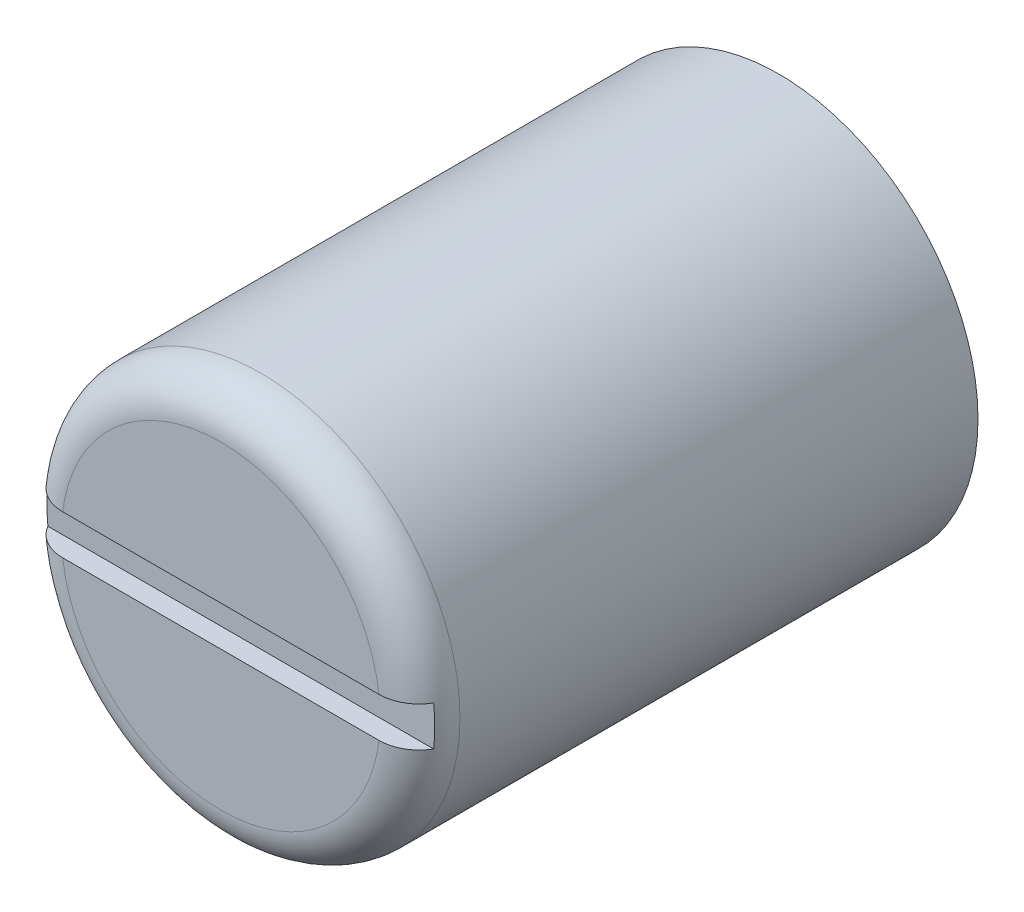
ISO-10303-21;
HEADER;
FILE_DESCRIPTION(('STEP AP214'),'2;1');
FILE_NAME('part.step','',(''),(''),'','','');
FILE_SCHEMA(('AUTOMOTIVE_DESIGN { 1 0 10303 214 1 1 1 1 }'));
ENDSEC;
DATA;
#1=APPLICATION_CONTEXT('core data for automotive mechanical design processes');
#2=APPLICATION_PROTOCOL_DEFINITION('international standard','automotive_design',2000,#1);
#3=PRODUCT_CONTEXT('',#1,'mechanical');
#4=PRODUCT('Part','Part','',(#3));
#5=PRODUCT_RELATED_PRODUCT_CATEGORY('part','',(#4));
#6=PRODUCT_DEFINITION_FORMATION('','',#4);
#7=PRODUCT_DEFINITION_CONTEXT('part definition',#1,'design');
#8=PRODUCT_DEFINITION('design','',#6,#7);
#9=PRODUCT_DEFINITION_SHAPE('','',#8);
#10=(LENGTH_UNIT() NAMED_UNIT(*) SI_UNIT(.MILLI.,.METRE.));
#11=(NAMED_UNIT(*) PLANE_ANGLE_UNIT() SI_UNIT($,.RADIAN.));
#12=(NAMED_UNIT(*) SI_UNIT($,.STERADIAN.) SOLID_ANGLE_UNIT());
#13=UNCERTAINTY_MEASURE_WITH_UNIT(LENGTH_MEASURE(1.E-05),#10,'distance_accuracy_value','');
#14=(GEOMETRIC_REPRESENTATION_CONTEXT(3) GLOBAL_UNCERTAINTY_ASSIGNED_CONTEXT((#13)) GLOBAL_UNIT_ASSIGNED_CONTEXT((#10,
#11,#12)) REPRESENTATION_CONTEXT('',''));
#15=CARTESIAN_POINT('',(0.,0.,0.));
#16=DIRECTION('',(0.,0.,1.));
#17=DIRECTION('',(1.,0.,0.));
#18=AXIS2_PLACEMENT_3D('',#15,#16,#17);
#19=CARTESIAN_POINT('',(15.4419708147866,-61.9743537667184,15.));
#20=DIRECTION('',(0.,0.,1.));
#21=DIRECTION('',(1.,0.,0.));
#22=AXIS2_PLACEMENT_3D('',#19,#20,#21);
#23=PLANE('',#22);
#24=DIRECTION('',(1.,0.,0.));
#25=VECTOR('',#24,1.);
#26=CARTESIAN_POINT('',(10.4419708147866,-62.4743537667184,15.));
#27=LINE('',#26,#25);
#28=CARTESIAN_POINT('',(11.4733438481897,-62.4743537667184,15.));
#29=VERTEX_POINT('',#28);
#30=CARTESIAN_POINT('',(19.4105977813835,-62.4743537667184,15.));
#31=VERTEX_POINT('',#30);
#32=EDGE_CURVE('E128',#29,#31,#27,.T.);
#33=ORIENTED_EDGE('',*,*,#32,.F.);
#34=CARTESIAN_POINT('',(15.4419708147866,-61.9743537667184,15.));
#35=DIRECTION('',(0.,0.,1.));
#36=DIRECTION('',(1.,0.,0.));
#37=AXIS2_PLACEMENT_3D('',#34,#35,#36);
#38=CIRCLE('',#37,4.);
#39=EDGE_CURVE('E135',#29,#31,#38,.T.);
#40=ORIENTED_EDGE('',*,*,#39,.T.);
#41=EDGE_LOOP('',(#33,#40));
#42=FACE_BOUND('',#41,.T.);
#43=ADVANCED_FACE('F48',(#42),#23,.T.);
#44=CARTESIAN_POINT('',(15.4419708147866,-61.9743537667184,15.));
#45=DIRECTION('',(0.,0.,-1.));
#46=DIRECTION('',(-1.,0.,0.));
#47=AXIS2_PLACEMENT_3D('',#44,#45,#46);
#48=CYLINDRICAL_SURFACE('',#47,5.);
#49=CARTESIAN_POINT('',(15.4419708147866,-61.9743537667184,14.));
#50=DIRECTION('',(0.,0.,1.));
#51=DIRECTION('',(1.,0.,0.));
#52=AXIS2_PLACEMENT_3D('',#49,#50,#51);
#53=CIRCLE('',#52,5.);
#54=CARTESIAN_POINT('',(20.4419708147866,-61.9743537667184,14.));
#55=VERTEX_POINT('',#54);
#56=EDGE_CURVE('E134',#55,#55,#53,.F.);
#57=ORIENTED_EDGE('',*,*,#56,.T.);
#58=EDGE_LOOP('',(#57));
#59=FACE_BOUND('',#58,.T.);
#60=CARTESIAN_POINT('',(15.4419708147866,-61.9743537667184,1.));
#61=DIRECTION('',(0.,0.,1.));
#62=DIRECTION('',(1.,0.,0.));
#63=AXIS2_PLACEMENT_3D('',#60,#61,#62);
#64=CIRCLE('',#63,5.);
#65=CARTESIAN_POINT('',(20.4419708147866,-61.9743537667184,1.));
#66=VERTEX_POINT('',#65);
#67=EDGE_CURVE('E201',#66,#66,#64,.T.);
#68=ORIENTED_EDGE('',*,*,#67,.T.);
#69=EDGE_LOOP('',(#68));
#70=FACE_BOUND('',#69,.T.);
#71=ADVANCED_FACE('F188',(#59,#70),#48,.T.);
#72=DIRECTION('',(-1.,0.,0.));
#73=VECTOR('',#72,1.);
#74=CARTESIAN_POINT('',(10.4419708147866,-61.4743537667184,15.));
#75=LINE('',#74,#73);
#76=CARTESIAN_POINT('',(19.4105977813835,-61.4743537667184,15.));
#77=VERTEX_POINT('',#76);
#78=CARTESIAN_POINT('',(11.4733438481897,-61.4743537667184,15.));
#79=VERTEX_POINT('',#78);
#80=EDGE_CURVE('E118',#77,#79,#75,.T.);
#81=ORIENTED_EDGE('',*,*,#80,.F.);
#82=EDGE_CURVE('E127',#77,#79,#38,.T.);
#83=ORIENTED_EDGE('',*,*,#82,.T.);
#84=EDGE_LOOP('',(#81,#83));
#85=FACE_BOUND('',#84,.T.);
#86=ADVANCED_FACE('F126',(#85),#23,.T.);
#87=CARTESIAN_POINT('',(15.4419708147866,-61.9743537667184,1.));
#88=DIRECTION('',(0.,0.,1.));
#89=DIRECTION('',(1.,0.,0.));
#90=AXIS2_PLACEMENT_3D('',#87,#88,#89);
#91=PLANE('',#90);
#92=DIRECTION('',(1.,0.,0.));
#93=VECTOR('',#92,1.);
#94=CARTESIAN_POINT('',(15.4419708147866,-65.0743537667184,1.));
#95=LINE('',#94,#93);
#96=CARTESIAN_POINT('',(14.3669708147866,-65.0743537667184,1.));
#97=VERTEX_POINT('',#96);
#98=CARTESIAN_POINT('',(16.5169708147866,-65.0743537667184,1.));
#99=VERTEX_POINT('',#98);
#100=EDGE_CURVE('E216',#97,#99,#95,.T.);
#101=ORIENTED_EDGE('',*,*,#100,.T.);
#102=DIRECTION('',(0.,1.,0.));
#103=VECTOR('',#102,1.);
#104=CARTESIAN_POINT('',(16.5169708147866,-61.9743537667184,1.));
#105=LINE('',#104,#103);
#106=CARTESIAN_POINT('',(16.5169708147866,-58.8743537667184,1.));
#107=VERTEX_POINT('',#106);
#108=EDGE_CURVE('E141',#99,#107,#105,.T.);
#109=ORIENTED_EDGE('',*,*,#108,.T.);
#110=DIRECTION('',(-1.,0.,0.));
#111=VECTOR('',#110,1.);
#112=CARTESIAN_POINT('',(15.4419708147866,-58.8743537667184,1.));
#113=LINE('',#112,#111);
#114=CARTESIAN_POINT('',(14.3669708147866,-58.8743537667184,1.));
#115=VERTEX_POINT('',#114);
#116=EDGE_CURVE('E203',#107,#115,#113,.T.);
#117=ORIENTED_EDGE('',*,*,#116,.T.);
#118=DIRECTION('',(0.,-1.,0.));
#119=VECTOR('',#118,1.);
#120=CARTESIAN_POINT('',(14.3669708147866,-61.9743537667184,1.));
#121=LINE('',#120,#119);
#122=EDGE_CURVE('E207',#115,#97,#121,.T.);
#123=ORIENTED_EDGE('',*,*,#122,.T.);
#124=EDGE_LOOP('',(#101,#109,#117,#123));
#125=FACE_BOUND('',#124,.T.);
#126=ORIENTED_EDGE('',*,*,#67,.F.);
#127=EDGE_LOOP('',(#126));
#128=FACE_BOUND('',#127,.T.);
#129=ADVANCED_FACE('F184',(#125,#128),#91,.F.);
#130=CARTESIAN_POINT('',(16.5169708147866,-65.0743537667184,-1.5));
#131=DIRECTION('',(1.,0.,0.));
#132=DIRECTION('',(0.,0.,-1.));
#133=AXIS2_PLACEMENT_3D('',#130,#131,#132);
#134=PLANE('',#133);
#135=DIRECTION('',(0.,0.,1.));
#136=VECTOR('',#135,1.);
#137=CARTESIAN_POINT('',(16.5169708147866,-65.0743537667184,-1.5));
#138=LINE('',#137,#136);
#139=CARTESIAN_POINT('',(16.5169708147866,-65.0743537667184,13.5));
#140=VERTEX_POINT('',#139);
#141=EDGE_CURVE('E204',#99,#140,#138,.T.);
#142=ORIENTED_EDGE('',*,*,#141,.T.);
#143=DIRECTION('',(0.,1.,0.));
#144=VECTOR('',#143,1.);
#145=CARTESIAN_POINT('',(16.5169708147866,-65.0743537667184,13.5));
#146=LINE('',#145,#144);
#147=CARTESIAN_POINT('',(16.5169708147866,-58.8743537667184,13.5));
#148=VERTEX_POINT('',#147);
#149=EDGE_CURVE('E236',#140,#148,#146,.T.);
#150=ORIENTED_EDGE('',*,*,#149,.T.);
#151=DIRECTION('',(0.,0.,1.));
#152=VECTOR('',#151,1.);
#153=CARTESIAN_POINT('',(16.5169708147866,-58.8743537667184,-1.5));
#154=LINE('',#153,#152);
#155=EDGE_CURVE('E212',#107,#148,#154,.T.);
#156=ORIENTED_EDGE('',*,*,#155,.F.);
#157=ORIENTED_EDGE('',*,*,#108,.F.);
#158=EDGE_LOOP('',(#142,#150,#156,#157));
#159=FACE_BOUND('',#158,.T.);
#160=ADVANCED_FACE('F175',(#159),#134,.F.);
#161=CARTESIAN_POINT('',(14.3669708147866,-65.0743537667184,-1.5));
#162=DIRECTION('',(0.,-1.,0.));
#163=DIRECTION('',(0.,0.,-1.));
#164=AXIS2_PLACEMENT_3D('',#161,#162,#163);
#165=PLANE('',#164);
#166=DIRECTION('',(0.,0.,1.));
#167=VECTOR('',#166,1.);
#168=CARTESIAN_POINT('',(14.3669708147866,-65.0743537667184,-1.5));
#169=LINE('',#168,#167);
#170=CARTESIAN_POINT('',(14.3669708147866,-65.0743537667184,13.5));
#171=VERTEX_POINT('',#170);
#172=EDGE_CURVE('E209',#97,#171,#169,.T.);
#173=ORIENTED_EDGE('',*,*,#172,.T.);
#174=DIRECTION('',(1.,0.,0.));
#175=VECTOR('',#174,1.);
#176=CARTESIAN_POINT('',(14.3669708147866,-65.0743537667184,13.5));
#177=LINE('',#176,#175);
#178=EDGE_CURVE('E226',#171,#140,#177,.T.);
#179=ORIENTED_EDGE('',*,*,#178,.T.);
#180=ORIENTED_EDGE('',*,*,#141,.F.);
#181=ORIENTED_EDGE('',*,*,#100,.F.);
#182=EDGE_LOOP('',(#173,#179,#180,#181));
#183=FACE_BOUND('',#182,.T.);
#184=ADVANCED_FACE('F171',(#183),#165,.F.);
#185=CARTESIAN_POINT('',(14.3669708147866,-65.0743537667184,-1.5));
#186=DIRECTION('',(-1.,0.,0.));
#187=DIRECTION('',(0.,0.,1.));
#188=AXIS2_PLACEMENT_3D('',#185,#186,#187);
#189=PLANE('',#188);
#190=DIRECTION('',(0.,0.,1.));
#191=VECTOR('',#190,1.);
#192=CARTESIAN_POINT('',(14.3669708147866,-58.8743537667184,-1.5));
#193=LINE('',#192,#191);
#194=CARTESIAN_POINT('',(14.3669708147866,-58.8743537667184,13.5));
#195=VERTEX_POINT('',#194);
#196=EDGE_CURVE('E76',#115,#195,#193,.T.);
#197=ORIENTED_EDGE('',*,*,#196,.T.);
#198=DIRECTION('',(0.,-1.,0.));
#199=VECTOR('',#198,1.);
#200=CARTESIAN_POINT('',(14.3669708147866,-65.0743537667184,13.5));
#201=LINE('',#200,#199);
#202=EDGE_CURVE('E229',#195,#171,#201,.T.);
#203=ORIENTED_EDGE('',*,*,#202,.T.);
#204=ORIENTED_EDGE('',*,*,#172,.F.);
#205=ORIENTED_EDGE('',*,*,#122,.F.);
#206=EDGE_LOOP('',(#197,#203,#204,#205));
#207=FACE_BOUND('',#206,.T.);
#208=ADVANCED_FACE('F174',(#207),#189,.F.);
#209=CARTESIAN_POINT('',(14.3669708147866,-58.8743537667184,-1.5));
#210=DIRECTION('',(0.,1.,0.));
#211=DIRECTION('',(0.,0.,1.));
#212=AXIS2_PLACEMENT_3D('',#209,#210,#211);
#213=PLANE('',#212);
#214=ORIENTED_EDGE('',*,*,#155,.T.);
#215=DIRECTION('',(-1.,0.,0.));
#216=VECTOR('',#215,1.);
#217=CARTESIAN_POINT('',(14.3669708147866,-58.8743537667184,13.5));
#218=LINE('',#217,#216);
#219=EDGE_CURVE('E231',#148,#195,#218,.T.);
#220=ORIENTED_EDGE('',*,*,#219,.T.);
#221=ORIENTED_EDGE('',*,*,#196,.F.);
#222=ORIENTED_EDGE('',*,*,#116,.F.);
#223=EDGE_LOOP('',(#214,#220,#221,#222));
#224=FACE_BOUND('',#223,.T.);
#225=ADVANCED_FACE('F169',(#224),#213,.F.);
#226=CARTESIAN_POINT('',(0.,0.,13.5));
#227=DIRECTION('',(0.,0.,-1.));
#228=DIRECTION('',(-1.,0.,0.));
#229=AXIS2_PLACEMENT_3D('',#226,#227,#228);
#230=PLANE('',#229);
#231=ORIENTED_EDGE('',*,*,#149,.F.);
#232=ORIENTED_EDGE('',*,*,#178,.F.);
#233=ORIENTED_EDGE('',*,*,#202,.F.);
#234=ORIENTED_EDGE('',*,*,#219,.F.);
#235=EDGE_LOOP('',(#231,#232,#233,#234));
#236=FACE_BOUND('',#235,.T.);
#237=ADVANCED_FACE('F162',(#236),#230,.T.);
#238=CARTESIAN_POINT('',(15.4419708147866,-61.9743537667184,14.));
#239=DIRECTION('',(0.,0.,1.));
#240=DIRECTION('',(1.,0.,0.));
#241=AXIS2_PLACEMENT_3D('',#238,#239,#240);
#242=TOROIDAL_SURFACE('',#241,4.,1.);
#243=CARTESIAN_POINT('',(18.5634032544821,-62.4743537667184,14.5444774529158));
#244=CARTESIAN_POINT('',(18.5945514288023,-62.4743537667184,14.5918529383722));
#245=CARTESIAN_POINT('',(18.6297596805643,-62.4743537667184,14.6366120911453));
#246=CARTESIAN_POINT('',(18.7072372831449,-62.4743537667184,14.7196070409792));
#247=CARTESIAN_POINT('',(18.7495161613722,-62.4743537667184,14.7578338935686));
#248=CARTESIAN_POINT('',(18.8398406210106,-62.4743537667184,14.8266391287087));
#249=CARTESIAN_POINT('',(18.8878809931753,-62.4743537667184,14.8572243444173));
#250=CARTESIAN_POINT('',(18.9883737984209,-62.4743537667184,14.9099456164324));
#251=CARTESIAN_POINT('',(19.0408250592627,-62.4743537667184,14.9320839089901));
#252=CARTESIAN_POINT('',(19.149026371219,-62.4743537667184,14.9674322522597));
#253=CARTESIAN_POINT('',(19.2047953173074,-62.4743537667184,14.9805844967894));
#254=CARTESIAN_POINT('',(19.3177520387492,-62.4743537667184,14.9973579815571));
#255=CARTESIAN_POINT('',(19.374939900161,-62.4743537667184,15.0009786422631));
#256=CARTESIAN_POINT('',(19.4892055798111,-62.4743537667184,14.9985673019673));
#257=CARTESIAN_POINT('',(19.5462830722008,-62.4743537667184,14.9925197362638));
#258=CARTESIAN_POINT('',(19.6586027137608,-62.4743537667184,14.9708899488506));
#259=CARTESIAN_POINT('',(19.7138448945469,-62.4743537667184,14.9553078914751));
#260=CARTESIAN_POINT('',(19.8206926505908,-62.4743537667184,14.9151058941002));
#261=CARTESIAN_POINT('',(19.8723114954291,-62.4743537667184,14.8905212305091));
#262=CARTESIAN_POINT('',(19.9706530317092,-62.4743537667184,14.8329826115909));
#263=CARTESIAN_POINT('',(20.0173758851745,-62.4743537667184,14.800028933344));
#264=CARTESIAN_POINT('',(20.1042899798965,-62.4743537667184,14.7269061248427));
#265=CARTESIAN_POINT('',(20.1445198868205,-62.4743537667184,14.6867829531965));
#266=CARTESIAN_POINT('',(20.2176235294583,-62.4743537667184,14.6003167266948));
#267=CARTESIAN_POINT('',(20.2504974957039,-62.4743537667184,14.5539738668343));
#268=CARTESIAN_POINT('',(20.3077540828749,-62.4743537667184,14.4566801402598));
#269=CARTESIAN_POINT('',(20.3321857846393,-62.4743537667184,14.4057581543057));
#270=CARTESIAN_POINT('',(20.3721128007541,-62.4743537667184,14.3005236544544));
#271=CARTESIAN_POINT('',(20.3876083434082,-62.4743537667184,14.2462112272167));
#272=CARTESIAN_POINT('',(20.4091644317986,-62.4743537667184,14.1359785766704));
#273=CARTESIAN_POINT('',(20.4152636362103,-62.4743537667184,14.0800659103388));
#274=CARTESIAN_POINT('',(20.4179715085408,-62.4743537667184,13.9680115538733));
#275=CARTESIAN_POINT('',(20.4145803006267,-62.4743537667184,13.9118698667454));
#276=CARTESIAN_POINT('',(20.3984198086183,-62.4743537667184,13.8010475977609));
#277=CARTESIAN_POINT('',(20.385665901805,-62.4743537667184,13.7463647723067));
#278=CARTESIAN_POINT('',(20.3511679080391,-62.4743537667184,13.6399132401183));
#279=CARTESIAN_POINT('',(20.3294238191914,-62.4743537667184,13.5881445339983));
#280=CARTESIAN_POINT('',(20.2775467857977,-62.4743537667184,13.4889277214239));
#281=CARTESIAN_POINT('',(20.2474050343708,-62.4743537667184,13.4414842206488));
#282=CARTESIAN_POINT('',(20.1796109109507,-62.4743537667184,13.3523079932481));
#283=CARTESIAN_POINT('',(20.1419584347758,-62.4743537667184,13.3105753458517));
#284=CARTESIAN_POINT('',(20.0600721891776,-62.4743537667184,13.2338393049474));
#285=CARTESIAN_POINT('',(20.0158152340028,-62.4743537667184,13.1988606565231));
#286=CARTESIAN_POINT('',(19.9220842752617,-62.4743537667184,13.1367818549939));
#287=CARTESIAN_POINT('',(19.8726101364887,-62.4743537667184,13.1096819061391));
#288=CARTESIAN_POINT('',(19.7695561804186,-62.4743537667184,13.0639652326668));
#289=CARTESIAN_POINT('',(19.7159550198757,-62.4743537667184,13.0453966239776));
#290=CARTESIAN_POINT('',(19.6064068978892,-62.4743537667184,13.017459323824));
#291=CARTESIAN_POINT('',(19.5504598546227,-62.4743537667184,13.008090953537));
#292=CARTESIAN_POINT('',(19.4374317901566,-62.4743537667184,12.9987613034033));
#293=CARTESIAN_POINT('',(19.3803458463648,-62.4743537667184,12.9988596394049));
#294=CARTESIAN_POINT('',(19.2669919678093,-62.4743537667184,13.00859019072));
#295=CARTESIAN_POINT('',(19.210724060066,-62.4743537667184,13.0182227202325));
#296=CARTESIAN_POINT('',(19.1003221118314,-62.4743537667184,13.0468125022984));
#297=CARTESIAN_POINT('',(19.0461995010866,-62.4743537667184,13.0658139141299));
#298=CARTESIAN_POINT('',(18.9419096720476,-62.4743537667184,13.1126317460749));
#299=CARTESIAN_POINT('',(18.8917425224448,-62.4743537667184,13.1404483192326));
#300=CARTESIAN_POINT('',(18.7968011308715,-62.4743537667184,13.2041307484164));
#301=CARTESIAN_POINT('',(18.7520271816031,-62.4743537667184,13.2399970410179));
#302=CARTESIAN_POINT('',(18.6691878551267,-62.4743537667184,13.318785954719));
#303=CARTESIAN_POINT('',(18.6311222935434,-62.4743537667184,13.361708381823));
#304=CARTESIAN_POINT('',(18.5630880739825,-62.4743537667184,13.4530818631245));
#305=CARTESIAN_POINT('',(18.5330642317636,-62.4743537667184,13.5014918128086));
#306=CARTESIAN_POINT('',(18.4816885353774,-62.4743537667184,13.6027114094157));
#307=CARTESIAN_POINT('',(18.4603356645745,-62.4743537667184,13.6555205396775));
#308=CARTESIAN_POINT('',(18.427183932417,-62.4743537667184,13.7633412874297));
#309=CARTESIAN_POINT('',(18.4152701748526,-62.4743537667184,13.8183175870589));
#310=CARTESIAN_POINT('',(18.4009386161295,-62.4743537667184,13.9295088047333));
#311=CARTESIAN_POINT('',(18.3985225963858,-62.4743537667184,13.9857239531514));
#312=CARTESIAN_POINT('',(18.4032444517991,-62.4743537667184,14.0972348815665));
#313=CARTESIAN_POINT('',(18.4102962809532,-62.4743537667184,14.1525343799151));
#314=CARTESIAN_POINT('',(18.4335783083382,-62.4743537667184,14.2611163046054));
#315=CARTESIAN_POINT('',(18.4497972547966,-62.4743537667184,14.3144011184034));
#316=CARTESIAN_POINT('',(18.4827738510871,-62.4743537667184,14.3971611227223));
#317=CARTESIAN_POINT('',(18.4968059577946,-62.4743537667184,14.4277516813605));
#318=CARTESIAN_POINT('',(18.5278837490367,-62.4743537667184,14.4873607454161));
#319=CARTESIAN_POINT('',(18.5449294105812,-62.4743537667184,14.5163792628242));
#320=CARTESIAN_POINT('',(18.5634032544821,-62.4743537667184,14.5444774529158));
#321=B_SPLINE_CURVE_WITH_KNOTS('',3,(#243,#244,#245,#246,#247,#248,#249,#250,#251,#252,#253,
#254,#255,#256,#257,#258,#259,#260,#261,#262,#263,#264,#265,#266,#267,#268,#269,#270,#271,#272,
#273,#274,#275,#276,#277,#278,#279,#280,#281,#282,#283,#284,#285,#286,#287,#288,#289,#290,#291,
#292,#293,#294,#295,#296,#297,#298,#299,#300,#301,#302,#303,#304,#305,#306,#307,#308,#309,#310,
#311,#312,#313,#314,#315,#316,#317,#318,#319,#320),.UNSPECIFIED.,.T.,.F.,(4,2,2,2,2,2,2,2,2,2,2,
2,2,2,2,2,2,2,2,2,2,2,2,2,2,2,2,2,2,2,2,2,2,2,2,2,2,2,4),(0.,0.169969099438129,
0.340169099047067,0.51021635655058,0.680218564197103,0.851304331526624,1.02240050084166,
1.1937723922497,1.36514133001706,1.53584582697731,1.70654467301128,1.87618616987225,
2.04582234950297,2.21445503272384,2.38308340747525,2.55101613619823,2.71894666779639,
2.8866020058894,3.05425737932409,3.22208924414842,3.38992343714108,3.5583613298003,
3.72680358871047,3.89618452342026,4.06557137095283,4.23602498836444,4.40648422325522,
4.57775469357084,4.74902813755468,4.92031087277709,5.091588899678,5.26165957452194,
5.43171030352118,5.59965787309224,5.76763694174751,5.9340996656937,6.10035851465293,
6.20116720194086,6.30197512020702),.UNSPECIFIED.);
#322=CARTESIAN_POINT('',(20.2822397360631,-62.4743537667184,14.5));
#323=VERTEX_POINT('',#322);
#324=EDGE_CURVE('E14',#31,#323,#321,.T.);
#325=ORIENTED_EDGE('',*,*,#324,.F.);
#326=ORIENTED_EDGE('',*,*,#39,.F.);
#327=CARTESIAN_POINT('',(10.7789985808341,-62.4743537667184,14.7240928017812));
#328=CARTESIAN_POINT('',(10.8200754441028,-62.4743537667184,14.7629921546293));
#329=CARTESIAN_POINT('',(10.8644842404171,-62.4743537667184,14.7984354333112));
#330=CARTESIAN_POINT('',(10.9586684738373,-62.4743537667184,14.8613777586814));
#331=CARTESIAN_POINT('',(11.0084506800533,-62.4743537667184,14.8888666206379));
#332=CARTESIAN_POINT('',(11.1118848571735,-62.4743537667184,14.9350905099144));
#333=CARTESIAN_POINT('',(11.165533900606,-62.4743537667184,14.9538320808433));
#334=CARTESIAN_POINT('',(11.2751925524834,-62.4743537667184,14.9820829338608));
#335=CARTESIAN_POINT('',(11.3312015746674,-62.4743537667184,14.9915944949039));
#336=CARTESIAN_POINT('',(11.4442890200255,-62.4743537667184,15.0011774549228));
#337=CARTESIAN_POINT('',(11.5013712536259,-62.4743537667184,15.0012038964142));
#338=CARTESIAN_POINT('',(11.614741064786,-62.4743537667184,14.9917219511811));
#339=CARTESIAN_POINT('',(11.6710285828144,-62.4743537667184,14.9822128539629));
#340=CARTESIAN_POINT('',(11.7814906178874,-62.4743537667184,14.9538656490675));
#341=CARTESIAN_POINT('',(11.8356537875495,-62.4743537667184,14.9349833013811));
#342=CARTESIAN_POINT('',(11.9400441391504,-62.4743537667184,14.8883955382217));
#343=CARTESIAN_POINT('',(11.990271266562,-62.4743537667184,14.8606900005453));
#344=CARTESIAN_POINT('',(12.085353001161,-62.4743537667184,14.7972170852941));
#345=CARTESIAN_POINT('',(12.1302070758051,-62.4743537667184,14.761448909612));
#346=CARTESIAN_POINT('',(12.2132222915719,-62.4743537667184,14.6828417495512));
#347=CARTESIAN_POINT('',(12.2513836410137,-62.4743537667184,14.6400029853337));
#348=CARTESIAN_POINT('',(12.3196230693745,-62.4743537667184,14.5487778020067));
#349=CARTESIAN_POINT('',(12.3497560171977,-62.4743537667184,14.5004324425802));
#350=CARTESIAN_POINT('',(12.4013607884356,-62.4743537667184,14.3993206571977));
#351=CARTESIAN_POINT('',(12.422833266853,-62.4743537667184,14.3465545659522));
#352=CARTESIAN_POINT('',(12.4562298531405,-62.4743537667184,14.2387914923571));
#353=CARTESIAN_POINT('',(12.4682676992702,-62.4743537667184,14.1838297538756));
#354=CARTESIAN_POINT('',(12.4828453527182,-62.4743537667184,14.0726619133909));
#355=CARTESIAN_POINT('',(12.4853858019686,-62.4743537667184,14.0164558957472));
#356=CARTESIAN_POINT('',(12.4809100085702,-62.4743537667184,13.9049664518246));
#357=CARTESIAN_POINT('',(12.4739848539129,-62.4743537667184,13.849679341775));
#358=CARTESIAN_POINT('',(12.4509579220022,-62.4743537667184,13.7410520465183));
#359=CARTESIAN_POINT('',(12.434856169264,-62.4743537667184,13.6877118561104));
#360=CARTESIAN_POINT('',(12.3939548156572,-62.4743537667184,13.5844221050627));
#361=CARTESIAN_POINT('',(12.3691469765007,-62.4743537667184,13.5344758095769));
#362=CARTESIAN_POINT('',(12.3115824020519,-62.4743537667184,13.4393972204176));
#363=CARTESIAN_POINT('',(12.2788252552066,-62.4743537667184,13.3942651761627));
#364=CARTESIAN_POINT('',(12.2059314306459,-62.4743537667184,13.3095827552529));
#365=CARTESIAN_POINT('',(12.1657207408261,-62.4743537667184,13.2700960970975));
#366=CARTESIAN_POINT('',(12.0793088892267,-62.4743537667184,13.1983368541333));
#367=CARTESIAN_POINT('',(12.0331073458008,-62.4743537667184,13.1660647292824));
#368=CARTESIAN_POINT('',(11.9354336504078,-62.4743537667184,13.109262032586));
#369=CARTESIAN_POINT('',(11.8839057208819,-62.4743537667184,13.0848273401972));
#370=CARTESIAN_POINT('',(11.7774957259666,-62.4743537667184,13.0448941516539));
#371=CARTESIAN_POINT('',(11.722613529711,-62.4743537667184,13.0293960044035));
#372=CARTESIAN_POINT('',(11.6106884526897,-62.4743537667184,13.0077024228175));
#373=CARTESIAN_POINT('',(11.5536343686769,-62.4743537667184,13.0015647276922));
#374=CARTESIAN_POINT('',(11.4393050692682,-62.4743537667184,12.9989617429495));
#375=CARTESIAN_POINT('',(11.3820298530616,-62.4743537667184,13.0024964888317));
#376=CARTESIAN_POINT('',(11.2689336938387,-62.4743537667184,13.0191543685682));
#377=CARTESIAN_POINT('',(11.213111691444,-62.4743537667184,13.0322703028963));
#378=CARTESIAN_POINT('',(11.1044815372983,-62.4743537667184,13.0677359497431));
#379=CARTESIAN_POINT('',(11.0516733133438,-62.4743537667184,13.0900854409404));
#380=CARTESIAN_POINT('',(10.9508609732389,-62.4743537667184,13.1432673335912));
#381=CARTESIAN_POINT('',(10.9028337166963,-62.4743537667184,13.1740558643744));
#382=CARTESIAN_POINT('',(10.8126730271054,-62.4743537667184,13.2433073621875));
#383=CARTESIAN_POINT('',(10.7705394106077,-62.4743537667184,13.2817700902546));
#384=CARTESIAN_POINT('',(10.6936451341962,-62.4743537667184,13.365015472707));
#385=CARTESIAN_POINT('',(10.6588394503148,-62.4743537667184,13.4097565395943));
#386=CARTESIAN_POINT('',(10.5972817380867,-62.4743537667184,13.5044732546531));
#387=CARTESIAN_POINT('',(10.5705294798434,-62.4743537667184,13.5544487533453));
#388=CARTESIAN_POINT('',(10.5259838276874,-62.4743537667184,13.6579262974569));
#389=CARTESIAN_POINT('',(10.5081431925143,-62.4743537667184,13.7114080093397));
#390=CARTESIAN_POINT('',(10.4817277213949,-62.4743537667184,13.8206104228071));
#391=CARTESIAN_POINT('',(10.4731523219343,-62.4743537667184,13.8763309880101));
#392=CARTESIAN_POINT('',(10.4655292077189,-62.4743537667184,13.9882309083746));
#393=CARTESIAN_POINT('',(10.4664495693446,-62.4743537667184,14.0444080922868));
#394=CARTESIAN_POINT('',(10.4777168548501,-62.4743537667184,14.1558242614066));
#395=CARTESIAN_POINT('',(10.4880660715699,-62.4743537667184,14.2110630150852));
#396=CARTESIAN_POINT('',(10.5178859092733,-62.4743537667184,14.3190047220705));
#397=CARTESIAN_POINT('',(10.5373550226265,-62.4743537667184,14.3717080929195));
#398=CARTESIAN_POINT('',(10.5848388039197,-62.4743537667184,14.4730588736338));
#399=CARTESIAN_POINT('',(10.6128430977814,-62.4743537667184,14.5217111165417));
#400=CARTESIAN_POINT('',(10.6643054281125,-62.4743537667184,14.5959524212801));
#401=CARTESIAN_POINT('',(10.6853808886977,-62.4743537667184,14.6232245752713));
#402=CARTESIAN_POINT('',(10.7302255743613,-62.4743537667184,14.6754556049605));
#403=CARTESIAN_POINT('',(10.7539947961476,-62.4743537667184,14.7004144834857));
#404=CARTESIAN_POINT('',(10.7789985808341,-62.4743537667184,14.7240928017812));
#405=B_SPLINE_CURVE_WITH_KNOTS('',3,(#327,#328,#329,#330,#331,#332,#333,#334,#335,#336,#337,
#338,#339,#340,#341,#342,#343,#344,#345,#346,#347,#348,#349,#350,#351,#352,#353,#354,#355,#356,
#357,#358,#359,#360,#361,#362,#363,#364,#365,#366,#367,#368,#369,#370,#371,#372,#373,#374,#375,
#376,#377,#378,#379,#380,#381,#382,#383,#384,#385,#386,#387,#388,#389,#390,#391,#392,#393,#394,
#395,#396,#397,#398,#399,#400,#401,#402,#403,#404),.UNSPECIFIED.,.T.,.F.,(4,2,2,2,2,2,2,2,2,2,2,
2,2,2,2,2,2,2,2,2,2,2,2,2,2,2,2,2,2,2,2,2,2,2,2,2,2,2,4),(0.,0.169591364346358,
0.339398920078427,0.509079243017456,0.678717660022622,0.849160117096799,1.01961527479273,
1.19088270999688,1.36215251739869,1.53343928596837,1.70472072208385,1.87479965014439,
2.04486571249681,2.21284859877046,2.38082013082148,2.54718659351009,2.71355261175392,
2.88007648315761,3.04660897770373,3.21489351074069,3.38318876958836,3.55347061629732,
3.72375911076666,3.89509382736906,4.06642917279929,4.23763590515259,4.40883853404541,
4.57916750836014,4.74949117971882,4.91873567122083,5.08797533093711,5.25630805480885,
5.42463054006354,5.59238733003316,5.76018492476421,5.9279547902866,6.09552154781011,
6.19875316784551,6.30198466171767),.UNSPECIFIED.);
#406=CARTESIAN_POINT('',(10.6017018935101,-62.4743537667184,14.5));
#407=VERTEX_POINT('',#406);
#408=EDGE_CURVE('E151',#407,#29,#405,.T.);
#409=ORIENTED_EDGE('',*,*,#408,.F.);
#410=CARTESIAN_POINT('',(15.4419708147866,-61.9743537667184,14.5));
#411=DIRECTION('',(0.,0.,-1.));
#412=DIRECTION('',(-1.,0.,0.));
#413=AXIS2_PLACEMENT_3D('',#410,#411,#412);
#414=CIRCLE('',#413,4.86602540378444);
#415=CARTESIAN_POINT('',(10.6017018935101,-61.4743537667184,14.5));
#416=VERTEX_POINT('',#415);
#417=EDGE_CURVE('E138',#416,#407,#414,.F.);
#418=ORIENTED_EDGE('',*,*,#417,.F.);
#419=CARTESIAN_POINT('',(10.7789985808341,-61.4743537667184,14.7240928017812));
#420=CARTESIAN_POINT('',(10.7382660418804,-61.4743537667184,14.6855126143399));
#421=CARTESIAN_POINT('',(10.7007512228493,-61.4743537667184,14.6434778797674));
#422=CARTESIAN_POINT('',(10.6332741234185,-61.4743537667184,14.553676827904));
#423=CARTESIAN_POINT('',(10.6033204834965,-61.4743537667184,14.5059040446446));
#424=CARTESIAN_POINT('',(10.5518774875838,-61.4743537667184,14.4060116989767));
#425=CARTESIAN_POINT('',(10.530385599432,-61.4743537667184,14.3538934426075));
#426=CARTESIAN_POINT('',(10.4964895767002,-61.4743537667184,14.2467954015554));
#427=CARTESIAN_POINT('',(10.4840832502785,-61.4743537667184,14.1918163104633));
#428=CARTESIAN_POINT('',(10.4687307139119,-61.4743537667184,14.080694873064));
#429=CARTESIAN_POINT('',(10.4657605970103,-61.4743537667184,14.0245558297282));
#430=CARTESIAN_POINT('',(10.4692999920419,-61.4743537667184,13.9125758407304));
#431=CARTESIAN_POINT('',(10.4758097478593,-61.4743537667184,13.8567349027748));
#432=CARTESIAN_POINT('',(10.4981059257575,-61.4743537667184,13.7470081707556));
#433=CARTESIAN_POINT('',(10.5138810724605,-61.4743537667184,13.6931200846796));
#434=CARTESIAN_POINT('',(10.5542414597763,-61.4743537667184,13.5887516910165));
#435=CARTESIAN_POINT('',(10.5788267065451,-61.4743537667184,13.5382713858106));
#436=CARTESIAN_POINT('',(10.6361405626347,-61.4743537667184,13.4420656773245));
#437=CARTESIAN_POINT('',(10.6688812810322,-61.4743537667184,13.3963474891849));
#438=CARTESIAN_POINT('',(10.7415453599025,-61.4743537667184,13.3110296731199));
#439=CARTESIAN_POINT('',(10.7814688228636,-61.4743537667184,13.2714301325145));
#440=CARTESIAN_POINT('',(10.867530189415,-61.4743537667184,13.1992997176281));
#441=CARTESIAN_POINT('',(10.9136921742987,-61.4743537667184,13.1667975791479));
#442=CARTESIAN_POINT('',(11.0107921337818,-61.4743537667184,13.1099528268975));
#443=CARTESIAN_POINT('',(11.0617302458982,-61.4743537667184,13.0856104481603));
#444=CARTESIAN_POINT('',(11.1672511514252,-61.4743537667184,13.0456230569021));
#445=CARTESIAN_POINT('',(11.2218533756172,-61.4743537667184,13.0300293232387));
#446=CARTESIAN_POINT('',(11.3328935626204,-61.4743537667184,13.0081675694079));
#447=CARTESIAN_POINT('',(11.3893315893244,-61.4743537667184,13.0018998741765));
#448=CARTESIAN_POINT('',(11.5028166309956,-61.4743537667184,12.9988323269551));
#449=CARTESIAN_POINT('',(11.5598652494354,-61.4743537667184,13.0020917029739));
#450=CARTESIAN_POINT('',(11.6726160652133,-61.4743537667184,13.0180989335226));
#451=CARTESIAN_POINT('',(11.7283182185213,-61.4743537667184,13.0308470979077));
#452=CARTESIAN_POINT('',(11.8370393469676,-61.4743537667184,13.0655444921292));
#453=CARTESIAN_POINT('',(11.8900460270324,-61.4743537667184,13.0875322660294));
#454=CARTESIAN_POINT('',(11.9916127638464,-61.4743537667184,13.1401025134791));
#455=CARTESIAN_POINT('',(12.0401727767072,-61.4743537667184,13.1706850718463));
#456=CARTESIAN_POINT('',(12.1313967769672,-61.4743537667184,13.2395656679834));
#457=CARTESIAN_POINT('',(12.1740667161795,-61.4743537667184,13.2778558197246));
#458=CARTESIAN_POINT('',(12.2523085232078,-61.4743537667184,13.3611093071231));
#459=CARTESIAN_POINT('',(12.2878806651953,-61.4743537667184,13.4060723849038));
#460=CARTESIAN_POINT('',(12.350585143326,-61.4743537667184,13.5010112812028));
#461=CARTESIAN_POINT('',(12.3777845301922,-61.4743537667184,13.5509427990005));
#462=CARTESIAN_POINT('',(12.4232922449182,-61.4743537667184,13.6547054455651));
#463=CARTESIAN_POINT('',(12.4416012895434,-61.4743537667184,13.7085362595571));
#464=CARTESIAN_POINT('',(12.4685747422798,-61.4743537667184,13.8178490767248));
#465=CARTESIAN_POINT('',(12.4773566027985,-61.4743537667184,13.8733021087746));
#466=CARTESIAN_POINT('',(12.4854004235564,-61.4743537667184,13.9848931409111));
#467=CARTESIAN_POINT('',(12.4846629357446,-61.4743537667184,14.0410311010958));
#468=CARTESIAN_POINT('',(12.4737380293855,-61.4743537667184,14.1519150638872));
#469=CARTESIAN_POINT('',(12.4636276300851,-61.4743537667184,14.2066686797706));
#470=CARTESIAN_POINT('',(12.4343838820272,-61.4743537667184,14.313709086909));
#471=CARTESIAN_POINT('',(12.4152504629194,-61.4743537667184,14.365995858927));
#472=CARTESIAN_POINT('',(12.3684770897024,-61.4743537667184,14.4667999773224));
#473=CARTESIAN_POINT('',(12.3408122041611,-61.4743537667184,14.5153057470892));
#474=CARTESIAN_POINT('',(12.2778192812978,-61.4743537667184,14.6070547649459));
#475=CARTESIAN_POINT('',(12.2424907929184,-61.4743537667184,14.6502977030468));
#476=CARTESIAN_POINT('',(12.1647462823185,-61.4743537667184,14.7308222712154));
#477=CARTESIAN_POINT('',(12.1222540449358,-61.4743537667184,14.7680303130451));
#478=CARTESIAN_POINT('',(12.0316851114377,-61.4743537667184,14.8348805880216));
#479=CARTESIAN_POINT('',(11.9836080613455,-61.4743537667184,14.8645223412205));
#480=CARTESIAN_POINT('',(11.8826499097925,-61.4743537667184,14.9157313938182));
#481=CARTESIAN_POINT('',(11.8297210423689,-61.4743537667184,14.9372045612998));
#482=CARTESIAN_POINT('',(11.7210218775402,-61.4743537667184,14.9710092939714));
#483=CARTESIAN_POINT('',(11.665251595985,-61.4743537667184,14.9833409101488));
#484=CARTESIAN_POINT('',(11.5521626790456,-61.4743537667184,14.9985501499689));
#485=CARTESIAN_POINT('',(11.4948379023491,-61.4743537667184,15.001382165485));
#486=CARTESIAN_POINT('',(11.3805121329589,-61.4743537667184,14.9973648813569));
#487=CARTESIAN_POINT('',(11.3235112229446,-61.4743537667184,14.9905132120579));
#488=CARTESIAN_POINT('',(11.2115545094839,-61.4743537667184,14.9673136799212));
#489=CARTESIAN_POINT('',(11.1565962358651,-61.4743537667184,14.9509777122983));
#490=CARTESIAN_POINT('',(11.0502761361821,-61.4743537667184,14.9092659130146));
#491=CARTESIAN_POINT('',(10.9989099817086,-61.4743537667184,14.8839011934269));
#492=CARTESIAN_POINT('',(10.9193485684876,-61.4743537667184,14.8358161983778));
#493=CARTESIAN_POINT('',(10.8896150509279,-61.4743537667184,14.8155931087382));
#494=CARTESIAN_POINT('',(10.8324808010119,-61.4743537667184,14.7720830596308));
#495=CARTESIAN_POINT('',(10.805080061865,-61.4743537667184,14.7487961090822));
#496=CARTESIAN_POINT('',(10.7789985808341,-61.4743537667184,14.7240928017812));
#497=B_SPLINE_CURVE_WITH_KNOTS('',3,(#419,#420,#421,#422,#423,#424,#425,#426,#427,#428,#429,
#430,#431,#432,#433,#434,#435,#436,#437,#438,#439,#440,#441,#442,#443,#444,#445,#446,#447,#448,
#449,#450,#451,#452,#453,#454,#455,#456,#457,#458,#459,#460,#461,#462,#463,#464,#465,#466,#467,
#468,#469,#470,#471,#472,#473,#474,#475,#476,#477,#478,#479,#480,#481,#482,#483,#484,#485,#486,
#487,#488,#489,#490,#491,#492,#493,#494,#495,#496),.UNSPECIFIED.,.T.,.F.,(4,2,2,2,2,2,2,2,2,2,2,
2,2,2,2,2,2,2,2,2,2,2,2,2,2,2,2,2,2,2,2,2,2,2,2,2,2,2,4),(0.,0.168179275758493,
0.336549875796475,0.504870052928772,0.673149610357403,0.841002484426346,1.00885967684481,
1.17651301998429,1.34416648026962,1.5120703684611,1.67997665261128,1.84855064064518,
2.01712948385251,2.18668637075132,2.35624916517875,2.5268683372002,2.6974930810145,
2.86883678408538,3.04018217811982,3.21135314304103,3.38251749474525,3.55227315239051,
3.72201512156267,3.88963983820191,4.05725483570134,4.22350459779126,4.38975565611442,
4.55649722760139,4.72324861567702,4.89190119697339,5.06056447364891,5.23111638861519,
5.4016673523147,5.57303597788146,5.74444654562259,5.91564259308943,6.08662866661352,
6.19431597194953,6.30200296380339),.UNSPECIFIED.);
#498=EDGE_CURVE('E133',#79,#416,#497,.T.);
#499=ORIENTED_EDGE('',*,*,#498,.F.);
#500=ORIENTED_EDGE('',*,*,#82,.F.);
#501=CARTESIAN_POINT('',(18.5634032544821,-61.4743537667184,14.5444774529158));
#502=CARTESIAN_POINT('',(18.5327937048232,-61.4743537667184,14.4979122876217));
#503=CARTESIAN_POINT('',(18.5060616248209,-61.4743537667184,14.4487532333069));
#504=CARTESIAN_POINT('',(18.4611901693098,-61.4743537667184,14.346613095175));
#505=CARTESIAN_POINT('',(18.4430598299572,-61.4743537667184,14.2936280591566));
#506=CARTESIAN_POINT('',(18.4159829125174,-61.4743537667184,14.1853578764841));
#507=CARTESIAN_POINT('',(18.4070357280343,-61.4743537667184,14.1300728819553));
#508=CARTESIAN_POINT('',(18.3986127663618,-61.4743537667184,14.018799604536));
#509=CARTESIAN_POINT('',(18.3991346969823,-61.4743537667184,13.9628114951278));
#510=CARTESIAN_POINT('',(18.4095974051763,-61.4743537667184,13.8520333128916));
#511=CARTESIAN_POINT('',(18.4194866420867,-61.4743537667184,13.7972383617725));
#512=CARTESIAN_POINT('',(18.4482997898001,-61.4743537667184,13.6900775769945));
#513=CARTESIAN_POINT('',(18.4672240954923,-61.4743537667184,13.6377118496177));
#514=CARTESIAN_POINT('',(18.513592895305,-61.4743537667184,13.5367240686879));
#515=CARTESIAN_POINT('',(18.5410611284745,-61.4743537667184,13.488112922789));
#516=CARTESIAN_POINT('',(18.6036812615784,-61.4743537667184,13.3961225513249));
#517=CARTESIAN_POINT('',(18.6388335809854,-61.4743537667184,13.3527436115856));
#518=CARTESIAN_POINT('',(18.7162470505448,-61.4743537667184,13.2719203774711));
#519=CARTESIAN_POINT('',(18.7585843735012,-61.4743537667184,13.2345490470306));
#520=CARTESIAN_POINT('',(18.8488723018383,-61.4743537667184,13.16734847314));
#521=CARTESIAN_POINT('',(18.8968232451289,-61.4743537667184,13.1375196840522));
#522=CARTESIAN_POINT('',(18.9975618640517,-61.4743537667184,13.0859144331213));
#523=CARTESIAN_POINT('',(19.0503978064449,-61.4743537667184,13.0642321548836));
#524=CARTESIAN_POINT('',(19.1589491705725,-61.4743537667184,13.029994827319));
#525=CARTESIAN_POINT('',(19.2146646913059,-61.4743537667184,13.0174400920179));
#526=CARTESIAN_POINT('',(19.3276930625838,-61.4743537667184,13.0017752365332));
#527=CARTESIAN_POINT('',(19.3850124921325,-61.4743537667184,12.9987125176273));
#528=CARTESIAN_POINT('',(19.4993509855456,-61.4743537667184,13.0022698044797));
#529=CARTESIAN_POINT('',(19.556370050089,-61.4743537667184,13.0088897883426));
#530=CARTESIAN_POINT('',(19.66838383138,-61.4743537667184,13.0316296531957));
#531=CARTESIAN_POINT('',(19.7233817560771,-61.4743537667184,13.0477337219636));
#532=CARTESIAN_POINT('',(19.8298694585718,-61.4743537667184,13.088997407374));
#533=CARTESIAN_POINT('',(19.8813593255566,-61.4743537667184,13.1141567936964));
#534=CARTESIAN_POINT('',(19.9790644772582,-61.4743537667184,13.172672955981));
#535=CARTESIAN_POINT('',(20.0253071780023,-61.4743537667184,13.205983951109));
#536=CARTESIAN_POINT('',(20.1114981901617,-61.4743537667184,13.2799421968645));
#537=CARTESIAN_POINT('',(20.1514467113733,-61.4743537667184,13.3205892028725));
#538=CARTESIAN_POINT('',(20.2236497227246,-61.4743537667184,13.4077893145792));
#539=CARTESIAN_POINT('',(20.2559510894048,-61.4743537667184,13.4543036077623));
#540=CARTESIAN_POINT('',(20.3122392057352,-61.4743537667184,13.5521171439351));
#541=CARTESIAN_POINT('',(20.3362261993302,-61.4743537667184,13.6034162464819));
#542=CARTESIAN_POINT('',(20.375082248882,-61.4743537667184,13.7090610779598));
#543=CARTESIAN_POINT('',(20.3899971399755,-61.4743537667184,13.7633899518811));
#544=CARTESIAN_POINT('',(20.4104649707971,-61.4743537667184,13.8737832945288));
#545=CARTESIAN_POINT('',(20.4160180909351,-61.4743537667184,13.9298477297882));
#546=CARTESIAN_POINT('',(20.4175980572838,-61.4743537667184,14.0419496437337));
#547=CARTESIAN_POINT('',(20.413652092463,-61.4743537667184,14.0979867412637));
#548=CARTESIAN_POINT('',(20.3964056769852,-61.4743537667184,14.2086019719033));
#549=CARTESIAN_POINT('',(20.3831052804163,-61.4743537667184,14.2631801134468));
#550=CARTESIAN_POINT('',(20.347540222226,-61.4743537667184,14.3693191216549));
#551=CARTESIAN_POINT('',(20.325277495992,-61.4743537667184,14.420880636999));
#552=CARTESIAN_POINT('',(20.2724318177924,-61.4743537667184,14.5195464365125));
#553=CARTESIAN_POINT('',(20.2418488118528,-61.4743537667184,14.5666506917647));
#554=CARTESIAN_POINT('',(20.1731578833406,-61.4743537667184,14.6551934032795));
#555=CARTESIAN_POINT('',(20.1350317793913,-61.4743537667184,14.6966177524271));
#556=CARTESIAN_POINT('',(20.0523953807181,-61.4743537667184,14.7725142456617));
#557=CARTESIAN_POINT('',(20.0078849434914,-61.4743537667184,14.8069862345258));
#558=CARTESIAN_POINT('',(19.9135208519839,-61.4743537667184,14.8681791876405));
#559=CARTESIAN_POINT('',(19.8636428350183,-61.4743537667184,14.8948625786341));
#560=CARTESIAN_POINT('',(19.760135048661,-61.4743537667184,14.9395351086607));
#561=CARTESIAN_POINT('',(19.7065051545901,-61.4743537667184,14.9575239586071));
#562=CARTESIAN_POINT('',(19.5966618137563,-61.4743537667184,14.9844154203156));
#563=CARTESIAN_POINT('',(19.5404344324949,-61.4743537667184,14.9932611125997));
#564=CARTESIAN_POINT('',(19.4272940737938,-61.4743537667184,15.0014462860835));
#565=CARTESIAN_POINT('',(19.3703810982354,-61.4743537667184,15.0007857933616));
#566=CARTESIAN_POINT('',(19.2571358226283,-61.4743537667184,14.9899651271804));
#567=CARTESIAN_POINT('',(19.2008087220129,-61.4743537667184,14.9797505149502));
#568=CARTESIAN_POINT('',(19.0906431014187,-61.4743537667184,14.9500330561742));
#569=CARTESIAN_POINT('',(19.0368052624645,-61.4743537667184,14.9305276841192));
#570=CARTESIAN_POINT('',(18.9329976998173,-61.4743537667184,14.8826995936199));
#571=CARTESIAN_POINT('',(18.8830407175096,-61.4743537667184,14.8543492473433));
#572=CARTESIAN_POINT('',(18.7886625103759,-61.4743537667184,14.7896529356529));
#573=CARTESIAN_POINT('',(18.7442347506752,-61.4743537667184,14.7533165520676));
#574=CARTESIAN_POINT('',(18.6769279488935,-61.4743537667184,14.6879932169751));
#575=CARTESIAN_POINT('',(18.6520364160716,-61.4743537667184,14.66104654975));
#576=CARTESIAN_POINT('',(18.6053387271697,-61.4743537667184,14.6045996543978));
#577=CARTESIAN_POINT('',(18.5835325691283,-61.4743537667184,14.5750994278941));
#578=CARTESIAN_POINT('',(18.5634032544821,-61.4743537667184,14.5444774529158));
#579=B_SPLINE_CURVE_WITH_KNOTS('',3,(#501,#502,#503,#504,#505,#506,#507,#508,#509,#510,#511,
#512,#513,#514,#515,#516,#517,#518,#519,#520,#521,#522,#523,#524,#525,#526,#527,#528,#529,#530,
#531,#532,#533,#534,#535,#536,#537,#538,#539,#540,#541,#542,#543,#544,#545,#546,#547,#548,#549,
#550,#551,#552,#553,#554,#555,#556,#557,#558,#559,#560,#561,#562,#563,#564,#565,#566,#567,#568,
#569,#570,#571,#572,#573,#574,#575,#576,#577,#578),.UNSPECIFIED.,.T.,.F.,(4,2,2,2,2,2,2,2,2,2,2,
2,2,2,2,2,2,2,2,2,2,2,2,2,2,2,2,2,2,2,2,2,2,2,2,2,2,2,4),(0.,0.167042694292089,
0.334260481043714,0.501467225112852,0.668633493963012,0.834885293194416,1.00114435933818,
1.16786956119533,1.33460386682042,1.50323102913872,1.67186834713299,1.8423993495959,
2.01293621876499,2.18432335470973,2.35571010309765,2.52681191478171,2.69790937483228,
2.86806712903823,3.03821921037622,3.20729957729269,3.37637498295203,3.54458891277282,
3.71279960092108,3.8805293970017,4.04825822326308,4.21595084841778,4.38364456142789,
4.55174750755648,4.71985420644825,4.88875895676472,5.05766932264643,5.22762499693952,
5.39758020499295,5.56850974494759,5.73948577525567,5.91100129907576,6.08231214733101,
6.1921620839625,6.302011950759),.UNSPECIFIED.);
#580=CARTESIAN_POINT('',(20.2822397360631,-61.4743537667184,14.5));
#581=VERTEX_POINT('',#580);
#582=EDGE_CURVE('E61',#581,#77,#579,.T.);
#583=ORIENTED_EDGE('',*,*,#582,.F.);
#584=EDGE_CURVE('E123',#323,#581,#414,.F.);
#585=ORIENTED_EDGE('',*,*,#584,.F.);
#586=EDGE_LOOP('',(#325,#326,#409,#418,#499,#500,#583,#585));
#587=FACE_BOUND('',#586,.T.);
#588=ORIENTED_EDGE('',*,*,#56,.F.);
#589=EDGE_LOOP('',(#588));
#590=FACE_BOUND('',#589,.T.);
#591=ADVANCED_FACE('F50',(#587,#590),#242,.T.);
#592=CARTESIAN_POINT('',(10.4419708147866,-62.4743537667184,14.5));
#593=DIRECTION('',(0.,-1.,0.));
#594=DIRECTION('',(0.,0.,-1.));
#595=AXIS2_PLACEMENT_3D('',#592,#593,#594);
#596=PLANE('',#595);
#597=ORIENTED_EDGE('',*,*,#408,.T.);
#598=ORIENTED_EDGE('',*,*,#32,.T.);
#599=ORIENTED_EDGE('',*,*,#324,.T.);
#600=DIRECTION('',(1.,0.,0.));
#601=VECTOR('',#600,1.);
#602=CARTESIAN_POINT('',(10.4419708147866,-62.4743537667184,14.5));
#603=LINE('',#602,#601);
#604=EDGE_CURVE('E237',#407,#323,#603,.T.);
#605=ORIENTED_EDGE('',*,*,#604,.F.);
#606=EDGE_LOOP('',(#597,#598,#599,#605));
#607=FACE_BOUND('',#606,.T.);
#608=ADVANCED_FACE('F159',(#607),#596,.F.);
#609=CARTESIAN_POINT('',(10.4419708147866,-61.4743537667184,14.5));
#610=DIRECTION('',(0.,1.,0.));
#611=DIRECTION('',(0.,0.,1.));
#612=AXIS2_PLACEMENT_3D('',#609,#610,#611);
#613=PLANE('',#612);
#614=ORIENTED_EDGE('',*,*,#498,.T.);
#615=DIRECTION('',(-1.,0.,0.));
#616=VECTOR('',#615,1.);
#617=CARTESIAN_POINT('',(10.4419708147866,-61.4743537667184,14.5));
#618=LINE('',#617,#616);
#619=EDGE_CURVE('E68',#581,#416,#618,.T.);
#620=ORIENTED_EDGE('',*,*,#619,.F.);
#621=ORIENTED_EDGE('',*,*,#582,.T.);
#622=ORIENTED_EDGE('',*,*,#80,.T.);
#623=EDGE_LOOP('',(#614,#620,#621,#622));
#624=FACE_BOUND('',#623,.T.);
#625=ADVANCED_FACE('F117',(#624),#613,.F.);
#626=CARTESIAN_POINT('',(0.,0.,14.5));
#627=DIRECTION('',(0.,0.,-1.));
#628=DIRECTION('',(-1.,0.,0.));
#629=AXIS2_PLACEMENT_3D('',#626,#627,#628);
#630=PLANE('',#629);
#631=ORIENTED_EDGE('',*,*,#584,.T.);
#632=ORIENTED_EDGE('',*,*,#619,.T.);
#633=ORIENTED_EDGE('',*,*,#417,.T.);
#634=ORIENTED_EDGE('',*,*,#604,.T.);
#635=EDGE_LOOP('',(#631,#632,#633,#634));
#636=FACE_BOUND('',#635,.T.);
#637=ADVANCED_FACE('F158',(#636),#630,.F.);
#638=CLOSED_SHELL('',(#43,#71,#86,#129,#160,#184,#208,#225,#237,#591,#608,#625,#637));
#639=MANIFOLD_SOLID_BREP('B2',#638);
#640=ADVANCED_BREP_SHAPE_REPRESENTATION('',(#18,#639),#14);
#641=SHAPE_DEFINITION_REPRESENTATION(#9,#640);
ENDSEC;
END-ISO-10303-21;
